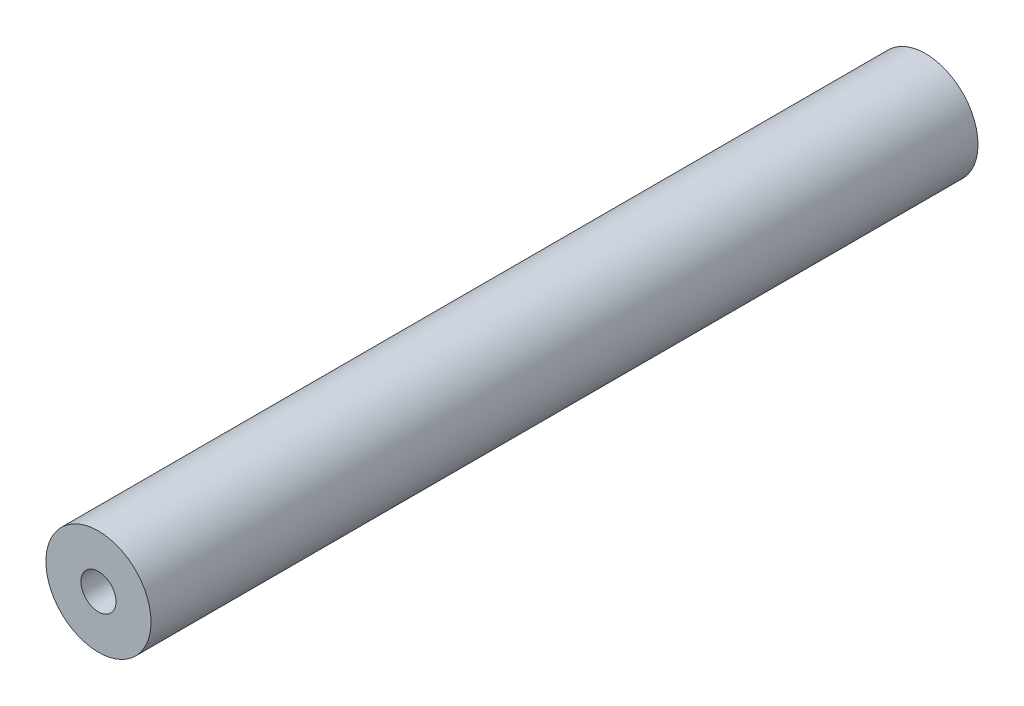
ISO-10303-21;
HEADER;
FILE_DESCRIPTION(('STEP AP214'),'2;1');
FILE_NAME('part.step','',(''),(''),'','','');
FILE_SCHEMA(('AUTOMOTIVE_DESIGN { 1 0 10303 214 1 1 1 1 }'));
ENDSEC;
DATA;
#1=APPLICATION_CONTEXT('core data for automotive mechanical design processes');
#2=APPLICATION_PROTOCOL_DEFINITION('international standard','automotive_design',2000,#1);
#3=PRODUCT_CONTEXT('',#1,'mechanical');
#4=PRODUCT('Part','Part','',(#3));
#5=PRODUCT_RELATED_PRODUCT_CATEGORY('part','',(#4));
#6=PRODUCT_DEFINITION_FORMATION('','',#4);
#7=PRODUCT_DEFINITION_CONTEXT('part definition',#1,'design');
#8=PRODUCT_DEFINITION('design','',#6,#7);
#9=PRODUCT_DEFINITION_SHAPE('','',#8);
#10=(LENGTH_UNIT() NAMED_UNIT(*) SI_UNIT(.MILLI.,.METRE.));
#11=(NAMED_UNIT(*) PLANE_ANGLE_UNIT() SI_UNIT($,.RADIAN.));
#12=(NAMED_UNIT(*) SI_UNIT($,.STERADIAN.) SOLID_ANGLE_UNIT());
#13=UNCERTAINTY_MEASURE_WITH_UNIT(LENGTH_MEASURE(1.E-05),#10,'distance_accuracy_value','');
#14=(GEOMETRIC_REPRESENTATION_CONTEXT(3) GLOBAL_UNCERTAINTY_ASSIGNED_CONTEXT((#13)) GLOBAL_UNIT_ASSIGNED_CONTEXT((#10,
#11,#12)) REPRESENTATION_CONTEXT('',''));
#15=CARTESIAN_POINT('',(0.,0.,0.));
#16=DIRECTION('',(0.,0.,1.));
#17=DIRECTION('',(1.,0.,0.));
#18=AXIS2_PLACEMENT_3D('',#15,#16,#17);
#19=CARTESIAN_POINT('',(0.,0.,-118.));
#20=DIRECTION('',(0.,0.,1.));
#21=DIRECTION('',(1.,0.,0.));
#22=AXIS2_PLACEMENT_3D('',#19,#20,#21);
#23=CYLINDRICAL_SURFACE('',#22,15.);
#24=CARTESIAN_POINT('',(0.,0.,-118.));
#25=DIRECTION('',(0.,0.,1.));
#26=DIRECTION('',(1.,0.,0.));
#27=AXIS2_PLACEMENT_3D('',#24,#25,#26);
#28=CIRCLE('',#27,15.);
#29=CARTESIAN_POINT('',(15.,0.,-118.));
#30=VERTEX_POINT('',#29);
#31=EDGE_CURVE('E10',#30,#30,#28,.T.);
#32=ORIENTED_EDGE('',*,*,#31,.T.);
#33=EDGE_LOOP('',(#32));
#34=FACE_BOUND('',#33,.T.);
#35=CARTESIAN_POINT('',(0.,0.,118.));
#36=DIRECTION('',(0.,0.,1.));
#37=DIRECTION('',(1.,0.,0.));
#38=AXIS2_PLACEMENT_3D('',#35,#36,#37);
#39=CIRCLE('',#38,15.);
#40=CARTESIAN_POINT('',(15.,0.,118.));
#41=VERTEX_POINT('',#40);
#42=EDGE_CURVE('E45',#41,#41,#39,.T.);
#43=ORIENTED_EDGE('',*,*,#42,.F.);
#44=EDGE_LOOP('',(#43));
#45=FACE_BOUND('',#44,.T.);
#46=ADVANCED_FACE('F39',(#34,#45),#23,.T.);
#47=CARTESIAN_POINT('',(0.,0.,-118.));
#48=DIRECTION('',(0.,0.,1.));
#49=DIRECTION('',(1.,0.,0.));
#50=AXIS2_PLACEMENT_3D('',#47,#48,#49);
#51=PLANE('',#50);
#52=CARTESIAN_POINT('',(0.,0.,-118.));
#53=DIRECTION('',(0.,0.,1.));
#54=DIRECTION('',(1.,0.,0.));
#55=AXIS2_PLACEMENT_3D('',#52,#53,#54);
#56=CIRCLE('',#55,5.);
#57=CARTESIAN_POINT('',(5.,0.,-118.));
#58=VERTEX_POINT('',#57);
#59=EDGE_CURVE('E47',#58,#58,#56,.T.);
#60=ORIENTED_EDGE('',*,*,#59,.T.);
#61=EDGE_LOOP('',(#60));
#62=FACE_BOUND('',#61,.T.);
#63=ORIENTED_EDGE('',*,*,#31,.F.);
#64=EDGE_LOOP('',(#63));
#65=FACE_BOUND('',#64,.T.);
#66=ADVANCED_FACE('F60',(#62,#65),#51,.F.);
#67=CARTESIAN_POINT('',(0.,0.,118.));
#68=DIRECTION('',(0.,0.,1.));
#69=DIRECTION('',(1.,0.,0.));
#70=AXIS2_PLACEMENT_3D('',#67,#68,#69);
#71=PLANE('',#70);
#72=CARTESIAN_POINT('',(0.,0.,118.));
#73=DIRECTION('',(0.,0.,1.));
#74=DIRECTION('',(1.,0.,0.));
#75=AXIS2_PLACEMENT_3D('',#72,#73,#74);
#76=CIRCLE('',#75,5.);
#77=CARTESIAN_POINT('',(5.,0.,118.));
#78=VERTEX_POINT('',#77);
#79=EDGE_CURVE('E51',#78,#78,#76,.T.);
#80=ORIENTED_EDGE('',*,*,#79,.F.);
#81=EDGE_LOOP('',(#80));
#82=FACE_BOUND('',#81,.T.);
#83=ORIENTED_EDGE('',*,*,#42,.T.);
#84=EDGE_LOOP('',(#83));
#85=FACE_BOUND('',#84,.T.);
#86=ADVANCED_FACE('F64',(#82,#85),#71,.T.);
#87=CARTESIAN_POINT('',(0.,0.,-118.));
#88=DIRECTION('',(0.,0.,1.));
#89=DIRECTION('',(1.,0.,0.));
#90=AXIS2_PLACEMENT_3D('',#87,#88,#89);
#91=CYLINDRICAL_SURFACE('',#90,5.);
#92=ORIENTED_EDGE('',*,*,#59,.F.);
#93=EDGE_LOOP('',(#92));
#94=FACE_BOUND('',#93,.T.);
#95=ORIENTED_EDGE('',*,*,#79,.T.);
#96=EDGE_LOOP('',(#95));
#97=FACE_BOUND('',#96,.T.);
#98=ADVANCED_FACE('F58',(#94,#97),#91,.F.);
#99=CLOSED_SHELL('',(#46,#66,#86,#98));
#100=MANIFOLD_SOLID_BREP('B2',#99);
#101=ADVANCED_BREP_SHAPE_REPRESENTATION('',(#18,#100),#14);
#102=SHAPE_DEFINITION_REPRESENTATION(#9,#101);
ENDSEC;
END-ISO-10303-21;
